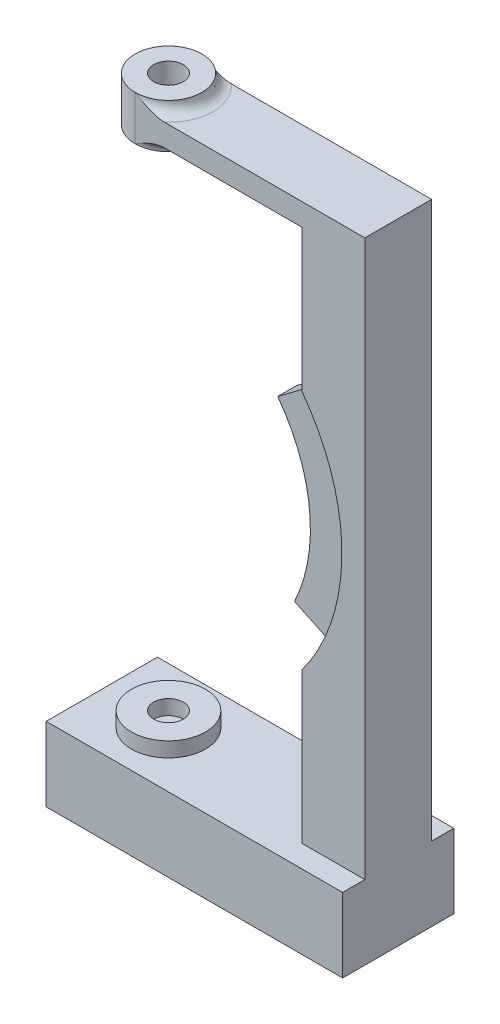
ISO-10303-21;
HEADER;
FILE_DESCRIPTION(('STEP AP214'),'2;1');
FILE_NAME('part.step','',(''),(''),'','','');
FILE_SCHEMA(('AUTOMOTIVE_DESIGN { 1 0 10303 214 1 1 1 1 }'));
ENDSEC;
DATA;
#1=APPLICATION_CONTEXT('core data for automotive mechanical design processes');
#2=APPLICATION_PROTOCOL_DEFINITION('international standard','automotive_design',2000,#1);
#3=PRODUCT_CONTEXT('',#1,'mechanical');
#4=PRODUCT('Part','Part','',(#3));
#5=PRODUCT_RELATED_PRODUCT_CATEGORY('part','',(#4));
#6=PRODUCT_DEFINITION_FORMATION('','',#4);
#7=PRODUCT_DEFINITION_CONTEXT('part definition',#1,'design');
#8=PRODUCT_DEFINITION('design','',#6,#7);
#9=PRODUCT_DEFINITION_SHAPE('','',#8);
#10=(LENGTH_UNIT() NAMED_UNIT(*) SI_UNIT(.MILLI.,.METRE.));
#11=(NAMED_UNIT(*) PLANE_ANGLE_UNIT() SI_UNIT($,.RADIAN.));
#12=(NAMED_UNIT(*) SI_UNIT($,.STERADIAN.) SOLID_ANGLE_UNIT());
#13=UNCERTAINTY_MEASURE_WITH_UNIT(LENGTH_MEASURE(1.E-05),#10,'distance_accuracy_value','');
#14=(GEOMETRIC_REPRESENTATION_CONTEXT(3) GLOBAL_UNCERTAINTY_ASSIGNED_CONTEXT((#13)) GLOBAL_UNIT_ASSIGNED_CONTEXT((#10,
#11,#12)) REPRESENTATION_CONTEXT('',''));
#15=CARTESIAN_POINT('',(0.,0.,0.));
#16=DIRECTION('',(0.,0.,1.));
#17=DIRECTION('',(1.,0.,0.));
#18=AXIS2_PLACEMENT_3D('',#15,#16,#17);
#19=CARTESIAN_POINT('',(-60.7,93.1,-30.));
#20=DIRECTION('',(0.,0.,1.));
#21=DIRECTION('',(1.,0.,0.));
#22=AXIS2_PLACEMENT_3D('',#19,#20,#21);
#23=CYLINDRICAL_SURFACE('',#22,54.5);
#24=CARTESIAN_POINT('',(-60.7,93.1,-22.5));
#25=DIRECTION('',(0.,0.,1.));
#26=DIRECTION('',(1.,0.,0.));
#27=AXIS2_PLACEMENT_3D('',#24,#25,#26);
#28=CIRCLE('',#27,54.5);
#29=CARTESIAN_POINT('',(-11.4562288879706,69.7483189755841,-22.5));
#30=VERTEX_POINT('',#29);
#31=CARTESIAN_POINT('',(-17.,125.666240188269,-22.5));
#32=VERTEX_POINT('',#31);
#33=EDGE_CURVE('E218',#30,#32,#28,.T.);
#34=ORIENTED_EDGE('',*,*,#33,.T.);
#35=DIRECTION('',(0.,0.,1.));
#36=VECTOR('',#35,1.);
#37=CARTESIAN_POINT('',(-17.,125.666240188269,-30.));
#38=LINE('',#37,#36);
#39=CARTESIAN_POINT('',(-17.,125.666240188269,-24.));
#40=VERTEX_POINT('',#39);
#41=EDGE_CURVE('E226',#40,#32,#38,.T.);
#42=ORIENTED_EDGE('',*,*,#41,.F.);
#43=CARTESIAN_POINT('',(-60.7,93.1,-24.));
#44=DIRECTION('',(0.,0.,1.));
#45=DIRECTION('',(1.,0.,0.));
#46=AXIS2_PLACEMENT_3D('',#43,#44,#45);
#47=CIRCLE('',#46,54.5);
#48=CARTESIAN_POINT('',(-17.,60.5337598117314,-24.));
#49=VERTEX_POINT('',#48);
#50=EDGE_CURVE('E244',#49,#40,#47,.T.);
#51=ORIENTED_EDGE('',*,*,#50,.F.);
#52=DIRECTION('',(0.,0.,1.));
#53=VECTOR('',#52,1.);
#54=CARTESIAN_POINT('',(-17.,60.5337598117314,-30.));
#55=LINE('',#54,#53);
#56=CARTESIAN_POINT('',(-17.,60.5337598117314,-6.));
#57=VERTEX_POINT('',#56);
#58=EDGE_CURVE('E238',#49,#57,#55,.T.);
#59=ORIENTED_EDGE('',*,*,#58,.T.);
#60=CARTESIAN_POINT('',(-60.7,93.1,-6.));
#61=DIRECTION('',(0.,0.,1.));
#62=DIRECTION('',(1.,0.,0.));
#63=AXIS2_PLACEMENT_3D('',#60,#61,#62);
#64=CIRCLE('',#63,54.5);
#65=CARTESIAN_POINT('',(-17.,125.666240188269,-6.));
#66=VERTEX_POINT('',#65);
#67=EDGE_CURVE('E248',#57,#66,#64,.T.);
#68=ORIENTED_EDGE('',*,*,#67,.T.);
#69=CARTESIAN_POINT('',(-17.,125.666240188269,-7.5));
#70=VERTEX_POINT('',#69);
#71=EDGE_CURVE('E241',#70,#66,#38,.T.);
#72=ORIENTED_EDGE('',*,*,#71,.F.);
#73=CARTESIAN_POINT('',(-60.7,93.1,-7.5));
#74=DIRECTION('',(0.,0.,1.));
#75=DIRECTION('',(1.,0.,0.));
#76=AXIS2_PLACEMENT_3D('',#73,#74,#75);
#77=CIRCLE('',#76,54.5);
#78=CARTESIAN_POINT('',(-11.4562288879706,69.7483189755841,-7.5));
#79=VERTEX_POINT('',#78);
#80=EDGE_CURVE('E281',#79,#70,#77,.T.);
#81=ORIENTED_EDGE('',*,*,#80,.F.);
#82=DIRECTION('',(0.,0.,1.));
#83=VECTOR('',#82,1.);
#84=CARTESIAN_POINT('',(-11.4562288879706,69.7483189755841,-12.5));
#85=LINE('',#84,#83);
#86=CARTESIAN_POINT('',(-11.4562288879706,69.7483189755841,-12.5));
#87=VERTEX_POINT('',#86);
#88=EDGE_CURVE('E254',#87,#79,#85,.T.);
#89=ORIENTED_EDGE('',*,*,#88,.F.);
#90=CARTESIAN_POINT('',(-60.7,93.1,-12.5));
#91=DIRECTION('',(0.,0.,1.));
#92=DIRECTION('',(1.,0.,0.));
#93=AXIS2_PLACEMENT_3D('',#90,#91,#92);
#94=CIRCLE('',#93,54.5);
#95=CARTESIAN_POINT('',(-17.,125.666240188269,-12.5));
#96=VERTEX_POINT('',#95);
#97=EDGE_CURVE('E273',#87,#96,#94,.T.);
#98=ORIENTED_EDGE('',*,*,#97,.T.);
#99=CARTESIAN_POINT('',(-17.,125.666240188269,-17.5));
#100=VERTEX_POINT('',#99);
#101=EDGE_CURVE('E239',#100,#96,#38,.T.);
#102=ORIENTED_EDGE('',*,*,#101,.F.);
#103=CARTESIAN_POINT('',(-60.7,93.1,-17.5));
#104=DIRECTION('',(0.,0.,1.));
#105=DIRECTION('',(1.,0.,0.));
#106=AXIS2_PLACEMENT_3D('',#103,#104,#105);
#107=CIRCLE('',#106,54.5);
#108=CARTESIAN_POINT('',(-11.4562288879706,69.7483189755841,-17.5));
#109=VERTEX_POINT('',#108);
#110=EDGE_CURVE('E63',#109,#100,#107,.T.);
#111=ORIENTED_EDGE('',*,*,#110,.F.);
#112=DIRECTION('',(0.,0.,1.));
#113=VECTOR('',#112,1.);
#114=CARTESIAN_POINT('',(-11.4562288879706,69.7483189755841,-22.5));
#115=LINE('',#114,#113);
#116=EDGE_CURVE('E228',#30,#109,#115,.T.);
#117=ORIENTED_EDGE('',*,*,#116,.F.);
#118=EDGE_LOOP('',(#34,#42,#51,#59,#68,#72,#81,#89,#98,#102,#111,#117));
#119=FACE_BOUND('',#118,.T.);
#120=ADVANCED_FACE('F41',(#119),#23,.F.);
#121=CARTESIAN_POINT('',(-17.,170.,-24.));
#122=DIRECTION('',(1.,0.,0.));
#123=DIRECTION('',(0.,0.,-1.));
#124=AXIS2_PLACEMENT_3D('',#121,#122,#123);
#125=PLANE('',#124);
#126=DIRECTION('',(0.,-1.,0.));
#127=VECTOR('',#126,1.);
#128=CARTESIAN_POINT('',(-17.,170.,-24.));
#129=LINE('',#128,#127);
#130=CARTESIAN_POINT('',(-17.,164.,-24.));
#131=VERTEX_POINT('',#130);
#132=EDGE_CURVE('E236',#131,#40,#129,.T.);
#133=ORIENTED_EDGE('',*,*,#132,.T.);
#134=ORIENTED_EDGE('',*,*,#41,.T.);
#135=DIRECTION('',(0.,0.,1.));
#136=VECTOR('',#135,1.);
#137=CARTESIAN_POINT('',(-17.,125.666240188269,-22.5));
#138=LINE('',#137,#136);
#139=EDGE_CURVE('E201',#32,#100,#138,.T.);
#140=ORIENTED_EDGE('',*,*,#139,.T.);
#141=ORIENTED_EDGE('',*,*,#101,.T.);
#142=DIRECTION('',(0.,0.,1.));
#143=VECTOR('',#142,1.);
#144=CARTESIAN_POINT('',(-17.,125.666240188269,-12.5));
#145=LINE('',#144,#143);
#146=EDGE_CURVE('E262',#96,#70,#145,.T.);
#147=ORIENTED_EDGE('',*,*,#146,.T.);
#148=ORIENTED_EDGE('',*,*,#71,.T.);
#149=DIRECTION('',(0.,-1.,0.));
#150=VECTOR('',#149,1.);
#151=CARTESIAN_POINT('',(-17.,170.,-6.));
#152=LINE('',#151,#150);
#153=CARTESIAN_POINT('',(-17.,164.,-6.));
#154=VERTEX_POINT('',#153);
#155=EDGE_CURVE('E463',#154,#66,#152,.T.);
#156=ORIENTED_EDGE('',*,*,#155,.F.);
#157=DIRECTION('',(0.,0.,1.));
#158=VECTOR('',#157,1.);
#159=CARTESIAN_POINT('',(-17.,164.,-24.));
#160=LINE('',#159,#158);
#161=EDGE_CURVE('E567',#131,#154,#160,.T.);
#162=ORIENTED_EDGE('',*,*,#161,.F.);
#163=EDGE_LOOP('',(#133,#134,#140,#141,#147,#148,#156,#162));
#164=FACE_BOUND('',#163,.T.);
#165=ADVANCED_FACE('F233',(#164),#125,.F.);
#166=CARTESIAN_POINT('',(0.,170.,0.));
#167=DIRECTION('',(0.,-1.,0.));
#168=DIRECTION('',(0.,0.,-1.));
#169=AXIS2_PLACEMENT_3D('',#166,#167,#168);
#170=PLANE('',#169);
#171=DIRECTION('',(-1.,0.,0.));
#172=VECTOR('',#171,1.);
#173=CARTESIAN_POINT('',(0.,170.,-24.));
#174=LINE('',#173,#172);
#175=CARTESIAN_POINT('',(0.,170.,-24.));
#176=VERTEX_POINT('',#175);
#177=CARTESIAN_POINT('',(-54.0627460668062,170.,-24.));
#178=VERTEX_POINT('',#177);
#179=EDGE_CURVE('E588',#176,#178,#174,.T.);
#180=ORIENTED_EDGE('',*,*,#179,.T.);
#181=CARTESIAN_POINT('',(-62.,170.,-15.));
#182=DIRECTION('',(0.,-1.,0.));
#183=DIRECTION('',(0.,0.,-1.));
#184=AXIS2_PLACEMENT_3D('',#181,#182,#183);
#185=CIRCLE('',#184,12.);
#186=CARTESIAN_POINT('',(-54.0627460668062,170.,-6.));
#187=VERTEX_POINT('',#186);
#188=EDGE_CURVE('E524',#178,#187,#185,.T.);
#189=ORIENTED_EDGE('',*,*,#188,.T.);
#190=DIRECTION('',(1.,0.,0.));
#191=VECTOR('',#190,1.);
#192=CARTESIAN_POINT('',(0.,170.,-6.));
#193=LINE('',#192,#191);
#194=CARTESIAN_POINT('',(0.,170.,-6.));
#195=VERTEX_POINT('',#194);
#196=EDGE_CURVE('E592',#187,#195,#193,.T.);
#197=ORIENTED_EDGE('',*,*,#196,.T.);
#198=DIRECTION('',(0.,0.,-1.));
#199=VECTOR('',#198,1.);
#200=CARTESIAN_POINT('',(0.,170.,-24.));
#201=LINE('',#200,#199);
#202=EDGE_CURVE('E584',#195,#176,#201,.T.);
#203=ORIENTED_EDGE('',*,*,#202,.T.);
#204=EDGE_LOOP('',(#180,#189,#197,#203));
#205=FACE_BOUND('',#204,.T.);
#206=ADVANCED_FACE('F357',(#205),#170,.F.);
#207=CARTESIAN_POINT('',(-17.,20.,-6.));
#208=VERTEX_POINT('',#207);
#209=EDGE_CURVE('E468',#57,#208,#152,.T.);
#210=ORIENTED_EDGE('',*,*,#209,.F.);
#211=ORIENTED_EDGE('',*,*,#58,.F.);
#212=CARTESIAN_POINT('',(-17.,20.,-24.));
#213=VERTEX_POINT('',#212);
#214=EDGE_CURVE('E455',#49,#213,#129,.T.);
#215=ORIENTED_EDGE('',*,*,#214,.T.);
#216=DIRECTION('',(0.,0.,1.));
#217=VECTOR('',#216,1.);
#218=CARTESIAN_POINT('',(-17.,20.,-24.));
#219=LINE('',#218,#217);
#220=EDGE_CURVE('E598',#213,#208,#219,.T.);
#221=ORIENTED_EDGE('',*,*,#220,.T.);
#222=EDGE_LOOP('',(#210,#211,#215,#221));
#223=FACE_BOUND('',#222,.T.);
#224=ADVANCED_FACE('F359',(#223),#125,.F.);
#225=CARTESIAN_POINT('',(0.,20.,0.));
#226=DIRECTION('',(-1.,0.,0.));
#227=DIRECTION('',(0.,0.,1.));
#228=AXIS2_PLACEMENT_3D('',#225,#226,#227);
#229=PLANE('',#228);
#230=DIRECTION('',(0.,-1.,0.));
#231=VECTOR('',#230,1.);
#232=CARTESIAN_POINT('',(0.,170.,-6.));
#233=LINE('',#232,#231);
#234=CARTESIAN_POINT('',(0.,20.,-6.));
#235=VERTEX_POINT('',#234);
#236=EDGE_CURVE('E595',#195,#235,#233,.T.);
#237=ORIENTED_EDGE('',*,*,#236,.T.);
#238=DIRECTION('',(0.,0.,-1.));
#239=VECTOR('',#238,1.);
#240=CARTESIAN_POINT('',(0.,20.,0.));
#241=LINE('',#240,#239);
#242=CARTESIAN_POINT('',(0.,20.,0.));
#243=VERTEX_POINT('',#242);
#244=EDGE_CURVE('E475',#243,#235,#241,.T.);
#245=ORIENTED_EDGE('',*,*,#244,.F.);
#246=DIRECTION('',(0.,-1.,0.));
#247=VECTOR('',#246,1.);
#248=CARTESIAN_POINT('',(0.,20.,0.));
#249=LINE('',#248,#247);
#250=CARTESIAN_POINT('',(0.,0.,0.));
#251=VERTEX_POINT('',#250);
#252=EDGE_CURVE('E489',#243,#251,#249,.T.);
#253=ORIENTED_EDGE('',*,*,#252,.T.);
#254=DIRECTION('',(0.,0.,-1.));
#255=VECTOR('',#254,1.);
#256=CARTESIAN_POINT('',(0.,0.,0.));
#257=LINE('',#256,#255);
#258=CARTESIAN_POINT('',(0.,0.,-30.));
#259=VERTEX_POINT('',#258);
#260=EDGE_CURVE('E474',#251,#259,#257,.T.);
#261=ORIENTED_EDGE('',*,*,#260,.T.);
#262=DIRECTION('',(0.,-1.,0.));
#263=VECTOR('',#262,1.);
#264=CARTESIAN_POINT('',(0.,20.,-30.));
#265=LINE('',#264,#263);
#266=CARTESIAN_POINT('',(0.,20.,-30.));
#267=VERTEX_POINT('',#266);
#268=EDGE_CURVE('E513',#267,#259,#265,.T.);
#269=ORIENTED_EDGE('',*,*,#268,.F.);
#270=CARTESIAN_POINT('',(0.,20.,-24.));
#271=VERTEX_POINT('',#270);
#272=EDGE_CURVE('E480',#271,#267,#241,.T.);
#273=ORIENTED_EDGE('',*,*,#272,.F.);
#274=DIRECTION('',(0.,-1.,0.));
#275=VECTOR('',#274,1.);
#276=CARTESIAN_POINT('',(0.,170.,-24.));
#277=LINE('',#276,#275);
#278=EDGE_CURVE('E467',#176,#271,#277,.T.);
#279=ORIENTED_EDGE('',*,*,#278,.F.);
#280=ORIENTED_EDGE('',*,*,#202,.F.);
#281=EDGE_LOOP('',(#237,#245,#253,#261,#269,#273,#279,#280));
#282=FACE_BOUND('',#281,.T.);
#283=ADVANCED_FACE('F423',(#282),#229,.F.);
#284=CARTESIAN_POINT('',(0.,20.,-30.));
#285=DIRECTION('',(0.,0.,1.));
#286=DIRECTION('',(1.,0.,0.));
#287=AXIS2_PLACEMENT_3D('',#284,#285,#286);
#288=PLANE('',#287);
#289=DIRECTION('',(-1.,0.,0.));
#290=VECTOR('',#289,1.);
#291=CARTESIAN_POINT('',(0.,0.,-30.));
#292=LINE('',#291,#290);
#293=CARTESIAN_POINT('',(-80.,0.,-30.));
#294=VERTEX_POINT('',#293);
#295=EDGE_CURVE('E493',#259,#294,#292,.T.);
#296=ORIENTED_EDGE('',*,*,#295,.T.);
#297=DIRECTION('',(0.,-1.,0.));
#298=VECTOR('',#297,1.);
#299=CARTESIAN_POINT('',(-80.,20.,-30.));
#300=LINE('',#299,#298);
#301=CARTESIAN_POINT('',(-80.,20.,-30.));
#302=VERTEX_POINT('',#301);
#303=EDGE_CURVE('E509',#302,#294,#300,.T.);
#304=ORIENTED_EDGE('',*,*,#303,.F.);
#305=DIRECTION('',(-1.,0.,0.));
#306=VECTOR('',#305,1.);
#307=CARTESIAN_POINT('',(0.,20.,-30.));
#308=LINE('',#307,#306);
#309=EDGE_CURVE('E479',#267,#302,#308,.T.);
#310=ORIENTED_EDGE('',*,*,#309,.F.);
#311=ORIENTED_EDGE('',*,*,#268,.T.);
#312=EDGE_LOOP('',(#296,#304,#310,#311));
#313=FACE_BOUND('',#312,.T.);
#314=ADVANCED_FACE('F427',(#313),#288,.F.);
#315=CARTESIAN_POINT('',(-80.,20.,0.));
#316=DIRECTION('',(1.,0.,0.));
#317=DIRECTION('',(0.,0.,-1.));
#318=AXIS2_PLACEMENT_3D('',#315,#316,#317);
#319=PLANE('',#318);
#320=DIRECTION('',(0.,0.,1.));
#321=VECTOR('',#320,1.);
#322=CARTESIAN_POINT('',(-80.,0.,0.));
#323=LINE('',#322,#321);
#324=CARTESIAN_POINT('',(-80.,0.,0.));
#325=VERTEX_POINT('',#324);
#326=EDGE_CURVE('E496',#294,#325,#323,.T.);
#327=ORIENTED_EDGE('',*,*,#326,.T.);
#328=DIRECTION('',(0.,-1.,0.));
#329=VECTOR('',#328,1.);
#330=CARTESIAN_POINT('',(-80.,20.,0.));
#331=LINE('',#330,#329);
#332=CARTESIAN_POINT('',(-80.,20.,0.));
#333=VERTEX_POINT('',#332);
#334=EDGE_CURVE('E505',#333,#325,#331,.T.);
#335=ORIENTED_EDGE('',*,*,#334,.F.);
#336=DIRECTION('',(0.,0.,1.));
#337=VECTOR('',#336,1.);
#338=CARTESIAN_POINT('',(-80.,20.,0.));
#339=LINE('',#338,#337);
#340=EDGE_CURVE('E483',#302,#333,#339,.T.);
#341=ORIENTED_EDGE('',*,*,#340,.F.);
#342=ORIENTED_EDGE('',*,*,#303,.T.);
#343=EDGE_LOOP('',(#327,#335,#341,#342));
#344=FACE_BOUND('',#343,.T.);
#345=ADVANCED_FACE('F431',(#344),#319,.F.);
#346=CARTESIAN_POINT('',(0.,20.,0.));
#347=DIRECTION('',(0.,0.,-1.));
#348=DIRECTION('',(-1.,0.,0.));
#349=AXIS2_PLACEMENT_3D('',#346,#347,#348);
#350=PLANE('',#349);
#351=DIRECTION('',(1.,0.,0.));
#352=VECTOR('',#351,1.);
#353=CARTESIAN_POINT('',(0.,0.,0.));
#354=LINE('',#353,#352);
#355=EDGE_CURVE('E499',#325,#251,#354,.T.);
#356=ORIENTED_EDGE('',*,*,#355,.T.);
#357=ORIENTED_EDGE('',*,*,#252,.F.);
#358=DIRECTION('',(1.,0.,0.));
#359=VECTOR('',#358,1.);
#360=CARTESIAN_POINT('',(0.,20.,0.));
#361=LINE('',#360,#359);
#362=EDGE_CURVE('E486',#333,#243,#361,.T.);
#363=ORIENTED_EDGE('',*,*,#362,.F.);
#364=ORIENTED_EDGE('',*,*,#334,.T.);
#365=EDGE_LOOP('',(#356,#357,#363,#364));
#366=FACE_BOUND('',#365,.T.);
#367=ADVANCED_FACE('F435',(#366),#350,.F.);
#368=CARTESIAN_POINT('',(0.,20.,0.));
#369=DIRECTION('',(0.,1.,0.));
#370=DIRECTION('',(0.,0.,1.));
#371=AXIS2_PLACEMENT_3D('',#368,#369,#370);
#372=PLANE('',#371);
#373=CARTESIAN_POINT('',(-62.,20.,-15.));
#374=DIRECTION('',(0.,1.,0.));
#375=DIRECTION('',(0.,0.,1.));
#376=AXIS2_PLACEMENT_3D('',#373,#374,#375);
#377=CIRCLE('',#376,10.);
#378=CARTESIAN_POINT('',(-62.,20.,-4.99999999999999));
#379=VERTEX_POINT('',#378);
#380=EDGE_CURVE('E576',#379,#379,#377,.T.);
#381=ORIENTED_EDGE('',*,*,#380,.F.);
#382=EDGE_LOOP('',(#381));
#383=FACE_BOUND('',#382,.T.);
#384=DIRECTION('',(1.,0.,0.));
#385=VECTOR('',#384,1.);
#386=CARTESIAN_POINT('',(0.,20.,-6.));
#387=LINE('',#386,#385);
#388=EDGE_CURVE('E589',#208,#235,#387,.T.);
#389=ORIENTED_EDGE('',*,*,#388,.F.);
#390=ORIENTED_EDGE('',*,*,#220,.F.);
#391=DIRECTION('',(-1.,0.,0.));
#392=VECTOR('',#391,1.);
#393=CARTESIAN_POINT('',(0.,20.,-24.));
#394=LINE('',#393,#392);
#395=EDGE_CURVE('E457',#271,#213,#394,.T.);
#396=ORIENTED_EDGE('',*,*,#395,.F.);
#397=ORIENTED_EDGE('',*,*,#272,.T.);
#398=ORIENTED_EDGE('',*,*,#309,.T.);
#399=ORIENTED_EDGE('',*,*,#340,.T.);
#400=ORIENTED_EDGE('',*,*,#362,.T.);
#401=ORIENTED_EDGE('',*,*,#244,.T.);
#402=EDGE_LOOP('',(#389,#390,#396,#397,#398,#399,#400,#401));
#403=FACE_BOUND('',#402,.T.);
#404=ADVANCED_FACE('F439',(#383,#403),#372,.T.);
#405=CARTESIAN_POINT('',(0.,0.,0.));
#406=DIRECTION('',(0.,1.,0.));
#407=DIRECTION('',(0.,0.,1.));
#408=AXIS2_PLACEMENT_3D('',#405,#406,#407);
#409=PLANE('',#408);
#410=ORIENTED_EDGE('',*,*,#260,.F.);
#411=ORIENTED_EDGE('',*,*,#355,.F.);
#412=ORIENTED_EDGE('',*,*,#326,.F.);
#413=ORIENTED_EDGE('',*,*,#295,.F.);
#414=EDGE_LOOP('',(#410,#411,#412,#413));
#415=FACE_BOUND('',#414,.T.);
#416=ADVANCED_FACE('F441',(#415),#409,.F.);
#417=CARTESIAN_POINT('',(0.,170.,-24.));
#418=DIRECTION('',(0.,0.,1.));
#419=DIRECTION('',(1.,0.,0.));
#420=AXIS2_PLACEMENT_3D('',#417,#418,#419);
#421=PLANE('',#420);
#422=ORIENTED_EDGE('',*,*,#214,.F.);
#423=ORIENTED_EDGE('',*,*,#50,.T.);
#424=ORIENTED_EDGE('',*,*,#132,.F.);
#425=DIRECTION('',(-1.,0.,0.));
#426=VECTOR('',#425,1.);
#427=CARTESIAN_POINT('',(0.,164.,-24.));
#428=LINE('',#427,#426);
#429=CARTESIAN_POINT('',(-54.0627460668062,164.,-24.));
#430=VERTEX_POINT('',#429);
#431=EDGE_CURVE('E535',#131,#430,#428,.T.);
#432=ORIENTED_EDGE('',*,*,#431,.T.);
#433=CARTESIAN_POINT('',(-54.0627460668062,164.,-24.));
#434=CARTESIAN_POINT('',(-54.1760862791798,163.999996097603,-24.));
#435=CARTESIAN_POINT('',(-54.2893969372354,163.997190433976,-24.));
#436=CARTESIAN_POINT('',(-54.515730825254,163.986357448924,-24.));
#437=CARTESIAN_POINT('',(-54.628754143122,163.978331985279,-24.));
#438=CARTESIAN_POINT('',(-54.9666697149848,163.947041583533,-24.));
#439=CARTESIAN_POINT('',(-55.1909135662553,163.916559181755,-24.));
#440=CARTESIAN_POINT('',(-55.6332406605233,163.83963787401,-24.));
#441=CARTESIAN_POINT('',(-55.851366137291,163.793433853769,-24.));
#442=CARTESIAN_POINT('',(-56.2843447100589,163.687279691333,-24.));
#443=CARTESIAN_POINT('',(-56.4991958271631,163.627321562659,-24.));
#444=CARTESIAN_POINT('',(-56.9449632459061,163.489661664973,-24.));
#445=CARTESIAN_POINT('',(-57.1755282529704,163.410831905841,-24.));
#446=CARTESIAN_POINT('',(-57.6324065176434,163.241615603191,-24.));
#447=CARTESIAN_POINT('',(-57.8587185353015,163.151225747512,-24.));
#448=CARTESIAN_POINT('',(-58.531954936859,162.865796343792,-24.));
#449=CARTESIAN_POINT('',(-58.9728564658495,162.656603043088,-24.));
#450=CARTESIAN_POINT('',(-59.8453025186559,162.21358041951,-24.));
#451=CARTESIAN_POINT('',(-60.2767677897122,161.979600085545,-24.));
#452=CARTESIAN_POINT('',(-61.133362874173,161.500263148594,-23.9999999999999));
#453=CARTESIAN_POINT('',(-61.5584912659528,161.254904042163,-23.9999999999998));
#454=CARTESIAN_POINT('',(-61.9890455505519,161.006324553064,-24.));
#455=CARTESIAN_POINT('',(-61.9945227761524,161.00316227536,-24.));
#456=CARTESIAN_POINT('',(-62.,161.,-24.));
#457=B_SPLINE_CURVE_WITH_KNOTS('',3,(#433,#434,#435,#436,#437,#438,#439,#440,#441,#442,#443,
#444,#445,#446,#447,#448,#449,#450,#451,#452,#453,#454,#455,#456),.UNSPECIFIED.,.F.,.F.,(4,2,2,
2,2,2,2,2,2,2,2,4),(0.,0.339937513647226,0.679754106273997,1.35787472815943,2.0262791107125,
2.69507259674562,3.42570134991749,4.15653991138376,5.61923374816456,7.09141610075236,
8.56392389935176,8.58289756531276),.UNSPECIFIED.);
#458=CARTESIAN_POINT('',(-62.,161.,-24.));
#459=VERTEX_POINT('',#458);
#460=EDGE_CURVE('E409',#430,#459,#457,.T.);
#461=ORIENTED_EDGE('',*,*,#460,.T.);
#462=DIRECTION('',(0.,1.,0.));
#463=VECTOR('',#462,1.);
#464=CARTESIAN_POINT('',(-62.,164.,-24.));
#465=LINE('',#464,#463);
#466=CARTESIAN_POINT('',(-62.,173.,-24.));
#467=VERTEX_POINT('',#466);
#468=EDGE_CURVE('E533',#459,#467,#465,.T.);
#469=ORIENTED_EDGE('',*,*,#468,.T.);
#470=CARTESIAN_POINT('',(-54.0627460668062,170.,-24.));
#471=CARTESIAN_POINT('',(-54.1760862791798,170.000003902397,-24.));
#472=CARTESIAN_POINT('',(-54.2893969372354,170.002809566024,-24.));
#473=CARTESIAN_POINT('',(-54.515730825254,170.013642551076,-24.));
#474=CARTESIAN_POINT('',(-54.628754143122,170.021668014721,-24.));
#475=CARTESIAN_POINT('',(-54.9666697149848,170.052958416467,-24.));
#476=CARTESIAN_POINT('',(-55.1909135662553,170.083440818245,-24.));
#477=CARTESIAN_POINT('',(-55.6332406605233,170.16036212599,-24.));
#478=CARTESIAN_POINT('',(-55.851366137291,170.206566146231,-24.));
#479=CARTESIAN_POINT('',(-56.2843447100589,170.312720308667,-24.));
#480=CARTESIAN_POINT('',(-56.4991958271631,170.372678437341,-24.));
#481=CARTESIAN_POINT('',(-56.9449632459061,170.510338335027,-24.));
#482=CARTESIAN_POINT('',(-57.1755282529704,170.589168094159,-24.));
#483=CARTESIAN_POINT('',(-57.6324065176434,170.758384396809,-24.));
#484=CARTESIAN_POINT('',(-57.8587185353015,170.848774252488,-24.));
#485=CARTESIAN_POINT('',(-58.531954936859,171.134203656208,-24.));
#486=CARTESIAN_POINT('',(-58.9728564658495,171.343396956912,-24.));
#487=CARTESIAN_POINT('',(-59.8453025186559,171.78641958049,-24.));
#488=CARTESIAN_POINT('',(-60.2767677897122,172.020399914455,-24.));
#489=CARTESIAN_POINT('',(-61.133362874173,172.499736851406,-23.9999999999999));
#490=CARTESIAN_POINT('',(-61.5584912659528,172.745095957837,-23.9999999999998));
#491=CARTESIAN_POINT('',(-61.9890455505519,172.993675446936,-24.));
#492=CARTESIAN_POINT('',(-61.9945227761524,172.99683772464,-24.));
#493=CARTESIAN_POINT('',(-62.,173.,-24.));
#494=B_SPLINE_CURVE_WITH_KNOTS('',3,(#470,#471,#472,#473,#474,#475,#476,#477,#478,#479,#480,
#481,#482,#483,#484,#485,#486,#487,#488,#489,#490,#491,#492,#493),.UNSPECIFIED.,.F.,.F.,(4,2,2,
2,2,2,2,2,2,2,2,4),(0.,0.339937513647233,0.679754106274004,1.35787472815945,2.02627911071252,
2.69507259674564,3.42570134991753,4.15653991138376,5.61923374816454,7.09141610075234,
8.56392389935177,8.58289756531276),.UNSPECIFIED.);
#495=EDGE_CURVE('E56',#467,#178,#494,.F.);
#496=ORIENTED_EDGE('',*,*,#495,.T.);
#497=ORIENTED_EDGE('',*,*,#179,.F.);
#498=ORIENTED_EDGE('',*,*,#278,.T.);
#499=ORIENTED_EDGE('',*,*,#395,.T.);
#500=EDGE_LOOP('',(#422,#423,#424,#432,#461,#469,#496,#497,#498,#499));
#501=FACE_BOUND('',#500,.T.);
#502=ADVANCED_FACE('F397',(#501),#421,.F.);
#503=CARTESIAN_POINT('',(0.,170.,-6.));
#504=DIRECTION('',(0.,0.,-1.));
#505=DIRECTION('',(-1.,0.,0.));
#506=AXIS2_PLACEMENT_3D('',#503,#504,#505);
#507=PLANE('',#506);
#508=ORIENTED_EDGE('',*,*,#155,.T.);
#509=ORIENTED_EDGE('',*,*,#67,.F.);
#510=ORIENTED_EDGE('',*,*,#209,.T.);
#511=ORIENTED_EDGE('',*,*,#388,.T.);
#512=ORIENTED_EDGE('',*,*,#236,.F.);
#513=ORIENTED_EDGE('',*,*,#196,.F.);
#514=CARTESIAN_POINT('',(-54.0627460668062,170.,-6.));
#515=CARTESIAN_POINT('',(-54.1760862791799,170.000003902397,-6.));
#516=CARTESIAN_POINT('',(-54.2893969372358,170.002809566024,-6.));
#517=CARTESIAN_POINT('',(-54.5157308252547,170.013642551076,-6.));
#518=CARTESIAN_POINT('',(-54.628754143123,170.021668014721,-6.));
#519=CARTESIAN_POINT('',(-54.9666697149862,170.052958416468,-6.));
#520=CARTESIAN_POINT('',(-55.190913566257,170.083440818245,-6.));
#521=CARTESIAN_POINT('',(-55.6332406605249,170.16036212599,-6.));
#522=CARTESIAN_POINT('',(-55.8513661372922,170.206566146232,-6.));
#523=CARTESIAN_POINT('',(-56.2843447100595,170.312720308667,-6.));
#524=CARTESIAN_POINT('',(-56.4991958271634,170.372678437341,-6.));
#525=CARTESIAN_POINT('',(-56.944963245906,170.510338335027,-6.));
#526=CARTESIAN_POINT('',(-57.1755282529703,170.589168094159,-6.));
#527=CARTESIAN_POINT('',(-57.6324065176432,170.758384396809,-6.));
#528=CARTESIAN_POINT('',(-57.8587185353012,170.848774252488,-6.));
#529=CARTESIAN_POINT('',(-58.5319549368583,171.134203656208,-6.));
#530=CARTESIAN_POINT('',(-58.9728564658482,171.343396956912,-6.00000000000001));
#531=CARTESIAN_POINT('',(-59.8453025186553,171.786419580489,-5.99999999999998));
#532=CARTESIAN_POINT('',(-60.2767677897128,172.020399914452,-5.99999999999995));
#533=CARTESIAN_POINT('',(-61.133362874171,172.499736851408,-6.00000000000005));
#534=CARTESIAN_POINT('',(-61.5584912659468,172.745095957846,-6.0000000000002));
#535=CARTESIAN_POINT('',(-61.9890455505517,172.993675446936,-6.));
#536=CARTESIAN_POINT('',(-61.9945227761523,172.99683772464,-5.99999999999999));
#537=CARTESIAN_POINT('',(-62.,173.,-5.99999999999999));
#538=B_SPLINE_CURVE_WITH_KNOTS('',3,(#514,#515,#516,#517,#518,#519,#520,#521,#522,#523,#524,
#525,#526,#527,#528,#529,#530,#531,#532,#533,#534,#535,#536,#537),.UNSPECIFIED.,.F.,.F.,(4,2,2,
2,2,2,2,2,2,2,2,4),(0.,0.339937513647803,0.679754106275154,1.3578747281615,2.02627911071347,
2.69507259674563,3.42570134991729,4.15653991138341,5.61923374816323,7.09141610075153,
8.56392389935173,8.58289756531276),.UNSPECIFIED.);
#539=CARTESIAN_POINT('',(-62.,173.,-5.99999999999999));
#540=VERTEX_POINT('',#539);
#541=EDGE_CURVE('E11',#187,#540,#538,.T.);
#542=ORIENTED_EDGE('',*,*,#541,.T.);
#543=DIRECTION('',(0.,1.,0.));
#544=VECTOR('',#543,1.);
#545=CARTESIAN_POINT('',(-62.,164.,-5.99999999999999));
#546=LINE('',#545,#544);
#547=CARTESIAN_POINT('',(-62.,161.,-5.99999999999999));
#548=VERTEX_POINT('',#547);
#549=EDGE_CURVE('E564',#548,#540,#546,.T.);
#550=ORIENTED_EDGE('',*,*,#549,.F.);
#551=CARTESIAN_POINT('',(-54.0627460668062,164.,-5.99999999999999));
#552=CARTESIAN_POINT('',(-54.17608627918,163.999996097603,-6.));
#553=CARTESIAN_POINT('',(-54.2893969372358,163.997190433976,-6.));
#554=CARTESIAN_POINT('',(-54.5157308252548,163.986357448924,-6.));
#555=CARTESIAN_POINT('',(-54.628754143123,163.978331985279,-6.));
#556=CARTESIAN_POINT('',(-54.9666697149863,163.947041583532,-6.));
#557=CARTESIAN_POINT('',(-55.1909135662571,163.916559181755,-6.));
#558=CARTESIAN_POINT('',(-55.633240660525,163.83963787401,-6.));
#559=CARTESIAN_POINT('',(-55.8513661372923,163.793433853768,-6.));
#560=CARTESIAN_POINT('',(-56.2843447100595,163.687279691333,-6.));
#561=CARTESIAN_POINT('',(-56.4991958271634,163.627321562659,-6.));
#562=CARTESIAN_POINT('',(-56.944963245906,163.489661664973,-6.));
#563=CARTESIAN_POINT('',(-57.1755282529703,163.410831905841,-6.));
#564=CARTESIAN_POINT('',(-57.6324065176432,163.241615603191,-6.));
#565=CARTESIAN_POINT('',(-57.8587185353012,163.151225747512,-6.));
#566=CARTESIAN_POINT('',(-58.5319549368583,162.865796343792,-6.));
#567=CARTESIAN_POINT('',(-58.9728564658482,162.656603043088,-6.00000000000001));
#568=CARTESIAN_POINT('',(-59.8453025186553,162.213580419511,-5.99999999999998));
#569=CARTESIAN_POINT('',(-60.2767677897129,161.979600085548,-5.99999999999995));
#570=CARTESIAN_POINT('',(-61.133362874171,161.500263148592,-6.00000000000005));
#571=CARTESIAN_POINT('',(-61.5584912659467,161.254904042153,-6.0000000000002));
#572=CARTESIAN_POINT('',(-61.9890455505517,161.006324553064,-6.));
#573=CARTESIAN_POINT('',(-61.9945227761523,161.00316227536,-5.99999999999999));
#574=CARTESIAN_POINT('',(-62.,161.,-5.99999999999999));
#575=B_SPLINE_CURVE_WITH_KNOTS('',3,(#551,#552,#553,#554,#555,#556,#557,#558,#559,#560,#561,
#562,#563,#564,#565,#566,#567,#568,#569,#570,#571,#572,#573,#574),.UNSPECIFIED.,.F.,.F.,(4,2,2,
2,2,2,2,2,2,2,2,4),(0.,0.33993751364781,0.679754106275175,1.35787472816153,2.02627911071347,
2.69507259674563,3.4257013499173,4.15653991138343,5.61923374816323,7.09141610075152,
8.56392389935171,8.58289756531275),.UNSPECIFIED.);
#576=CARTESIAN_POINT('',(-54.0627460668062,164.,-5.99999999999999));
#577=VERTEX_POINT('',#576);
#578=EDGE_CURVE('E402',#548,#577,#575,.F.);
#579=ORIENTED_EDGE('',*,*,#578,.T.);
#580=DIRECTION('',(-1.,0.,0.));
#581=VECTOR('',#580,1.);
#582=CARTESIAN_POINT('',(0.,164.,-6.));
#583=LINE('',#582,#581);
#584=EDGE_CURVE('E560',#154,#577,#583,.T.);
#585=ORIENTED_EDGE('',*,*,#584,.F.);
#586=EDGE_LOOP('',(#508,#509,#510,#511,#512,#513,#542,#550,#579,#585));
#587=FACE_BOUND('',#586,.T.);
#588=ADVANCED_FACE('F388',(#587),#507,.F.);
#589=CARTESIAN_POINT('',(-62.,24.,-15.));
#590=DIRECTION('',(0.,1.,0.));
#591=DIRECTION('',(0.,0.,1.));
#592=AXIS2_PLACEMENT_3D('',#589,#590,#591);
#593=PLANE('',#592);
#594=CARTESIAN_POINT('',(-62.,24.,-15.));
#595=DIRECTION('',(0.,1.,0.));
#596=DIRECTION('',(0.,0.,1.));
#597=AXIS2_PLACEMENT_3D('',#594,#595,#596);
#598=CIRCLE('',#597,10.);
#599=CARTESIAN_POINT('',(-62.,24.,-4.99999999999999));
#600=VERTEX_POINT('',#599);
#601=EDGE_CURVE('E577',#600,#600,#598,.T.);
#602=ORIENTED_EDGE('',*,*,#601,.T.);
#603=EDGE_LOOP('',(#602));
#604=FACE_BOUND('',#603,.T.);
#605=CARTESIAN_POINT('',(-62.,24.,-15.));
#606=DIRECTION('',(0.,1.,0.));
#607=DIRECTION('',(0.,0.,1.));
#608=AXIS2_PLACEMENT_3D('',#605,#606,#607);
#609=CIRCLE('',#608,4.00000000000001);
#610=CARTESIAN_POINT('',(-62.,24.,-11.));
#611=VERTEX_POINT('',#610);
#612=EDGE_CURVE('E572',#611,#611,#609,.T.);
#613=ORIENTED_EDGE('',*,*,#612,.F.);
#614=EDGE_LOOP('',(#613));
#615=FACE_BOUND('',#614,.T.);
#616=ADVANCED_FACE('F385',(#604,#615),#593,.T.);
#617=CARTESIAN_POINT('',(-62.,24.,-15.));
#618=DIRECTION('',(0.,-1.,0.));
#619=DIRECTION('',(0.,0.,-1.));
#620=AXIS2_PLACEMENT_3D('',#617,#618,#619);
#621=CYLINDRICAL_SURFACE('',#620,10.);
#622=ORIENTED_EDGE('',*,*,#601,.F.);
#623=EDGE_LOOP('',(#622));
#624=FACE_BOUND('',#623,.T.);
#625=ORIENTED_EDGE('',*,*,#380,.T.);
#626=EDGE_LOOP('',(#625));
#627=FACE_BOUND('',#626,.T.);
#628=ADVANCED_FACE('F383',(#624,#627),#621,.T.);
#629=CARTESIAN_POINT('',(-62.,24.,-15.));
#630=DIRECTION('',(0.,-1.,0.));
#631=DIRECTION('',(0.,0.,-1.));
#632=AXIS2_PLACEMENT_3D('',#629,#630,#631);
#633=CYLINDRICAL_SURFACE('',#632,4.00000000000001);
#634=ORIENTED_EDGE('',*,*,#612,.T.);
#635=EDGE_LOOP('',(#634));
#636=FACE_BOUND('',#635,.T.);
#637=CARTESIAN_POINT('',(-62.,20.,-15.));
#638=DIRECTION('',(0.,1.,0.));
#639=DIRECTION('',(0.,0.,1.));
#640=AXIS2_PLACEMENT_3D('',#637,#638,#639);
#641=CIRCLE('',#640,4.00000000000001);
#642=CARTESIAN_POINT('',(-62.,20.,-11.));
#643=VERTEX_POINT('',#642);
#644=EDGE_CURVE('E517',#643,#643,#641,.F.);
#645=ORIENTED_EDGE('',*,*,#644,.T.);
#646=EDGE_LOOP('',(#645));
#647=FACE_BOUND('',#646,.T.);
#648=ADVANCED_FACE('F380',(#636,#647),#633,.F.);
#649=ORIENTED_EDGE('',*,*,#644,.F.);
#650=EDGE_LOOP('',(#649));
#651=FACE_BOUND('',#650,.T.);
#652=ADVANCED_FACE('F375',(#651),#372,.T.);
#653=CARTESIAN_POINT('',(0.,164.,0.));
#654=DIRECTION('',(0.,1.,0.));
#655=DIRECTION('',(0.,0.,1.));
#656=AXIS2_PLACEMENT_3D('',#653,#654,#655);
#657=PLANE('',#656);
#658=ORIENTED_EDGE('',*,*,#584,.T.);
#659=CARTESIAN_POINT('',(-62.,164.,-15.));
#660=DIRECTION('',(0.,1.,0.));
#661=DIRECTION('',(0.,0.,1.));
#662=AXIS2_PLACEMENT_3D('',#659,#660,#661);
#663=CIRCLE('',#662,12.);
#664=EDGE_CURVE('E521',#577,#430,#663,.T.);
#665=ORIENTED_EDGE('',*,*,#664,.T.);
#666=ORIENTED_EDGE('',*,*,#431,.F.);
#667=ORIENTED_EDGE('',*,*,#161,.T.);
#668=EDGE_LOOP('',(#658,#665,#666,#667));
#669=FACE_BOUND('',#668,.T.);
#670=ADVANCED_FACE('F372',(#669),#657,.F.);
#671=CARTESIAN_POINT('',(-62.,164.,-15.));
#672=DIRECTION('',(0.,1.,0.));
#673=DIRECTION('',(0.,0.,1.));
#674=AXIS2_PLACEMENT_3D('',#671,#672,#673);
#675=CYLINDRICAL_SURFACE('',#674,9.);
#676=ORIENTED_EDGE('',*,*,#468,.F.);
#677=CARTESIAN_POINT('',(-62.,161.,-15.));
#678=DIRECTION('',(0.,1.,0.));
#679=DIRECTION('',(0.,0.,1.));
#680=AXIS2_PLACEMENT_3D('',#677,#678,#679);
#681=CIRCLE('',#680,9.);
#682=EDGE_CURVE('E541',#459,#548,#681,.T.);
#683=ORIENTED_EDGE('',*,*,#682,.T.);
#684=ORIENTED_EDGE('',*,*,#549,.T.);
#685=CARTESIAN_POINT('',(-62.,173.,-15.));
#686=DIRECTION('',(0.,1.,0.));
#687=DIRECTION('',(0.,0.,1.));
#688=AXIS2_PLACEMENT_3D('',#685,#686,#687);
#689=CIRCLE('',#688,9.);
#690=EDGE_CURVE('E548',#467,#540,#689,.T.);
#691=ORIENTED_EDGE('',*,*,#690,.F.);
#692=EDGE_LOOP('',(#676,#683,#684,#691));
#693=FACE_BOUND('',#692,.T.);
#694=ADVANCED_FACE('F370',(#693),#675,.T.);
#695=CARTESIAN_POINT('',(0.,173.,0.));
#696=DIRECTION('',(0.,1.,0.));
#697=DIRECTION('',(0.,0.,1.));
#698=AXIS2_PLACEMENT_3D('',#695,#696,#697);
#699=PLANE('',#698);
#700=CARTESIAN_POINT('',(-62.,173.,-15.));
#701=DIRECTION('',(0.,1.,0.));
#702=DIRECTION('',(0.,0.,1.));
#703=AXIS2_PLACEMENT_3D('',#700,#701,#702);
#704=CIRCLE('',#703,4.00000000000001);
#705=CARTESIAN_POINT('',(-62.,173.,-11.));
#706=VERTEX_POINT('',#705);
#707=EDGE_CURVE('E880',#706,#706,#704,.T.);
#708=ORIENTED_EDGE('',*,*,#707,.F.);
#709=EDGE_LOOP('',(#708));
#710=FACE_BOUND('',#709,.T.);
#711=EDGE_CURVE('E551',#540,#467,#689,.T.);
#712=ORIENTED_EDGE('',*,*,#711,.T.);
#713=ORIENTED_EDGE('',*,*,#690,.T.);
#714=EDGE_LOOP('',(#712,#713));
#715=FACE_BOUND('',#714,.T.);
#716=ADVANCED_FACE('F366',(#710,#715),#699,.T.);
#717=CARTESIAN_POINT('',(0.,161.,0.));
#718=DIRECTION('',(0.,1.,0.));
#719=DIRECTION('',(0.,0.,1.));
#720=AXIS2_PLACEMENT_3D('',#717,#718,#719);
#721=PLANE('',#720);
#722=CARTESIAN_POINT('',(-62.,161.,-15.));
#723=DIRECTION('',(0.,1.,0.));
#724=DIRECTION('',(0.,0.,1.));
#725=AXIS2_PLACEMENT_3D('',#722,#723,#724);
#726=CIRCLE('',#725,4.00000000000001);
#727=CARTESIAN_POINT('',(-62.,161.,-11.));
#728=VERTEX_POINT('',#727);
#729=EDGE_CURVE('E545',#728,#728,#726,.F.);
#730=ORIENTED_EDGE('',*,*,#729,.F.);
#731=EDGE_LOOP('',(#730));
#732=FACE_BOUND('',#731,.T.);
#733=EDGE_CURVE('E542',#548,#459,#681,.T.);
#734=ORIENTED_EDGE('',*,*,#733,.F.);
#735=ORIENTED_EDGE('',*,*,#682,.F.);
#736=EDGE_LOOP('',(#734,#735));
#737=FACE_BOUND('',#736,.T.);
#738=ADVANCED_FACE('F362',(#732,#737),#721,.F.);
#739=CARTESIAN_POINT('',(-62.,161.,-15.));
#740=DIRECTION('',(0.,1.,0.));
#741=DIRECTION('',(0.,0.,1.));
#742=AXIS2_PLACEMENT_3D('',#739,#740,#741);
#743=TOROIDAL_SURFACE('',#742,12.,3.);
#744=ORIENTED_EDGE('',*,*,#578,.F.);
#745=ORIENTED_EDGE('',*,*,#733,.T.);
#746=ORIENTED_EDGE('',*,*,#460,.F.);
#747=ORIENTED_EDGE('',*,*,#664,.F.);
#748=EDGE_LOOP('',(#744,#745,#746,#747));
#749=FACE_BOUND('',#748,.T.);
#750=ADVANCED_FACE('F365',(#749),#743,.F.);
#751=CARTESIAN_POINT('',(-62.,173.,-15.));
#752=DIRECTION('',(0.,-1.,0.));
#753=DIRECTION('',(0.,0.,-1.));
#754=AXIS2_PLACEMENT_3D('',#751,#752,#753);
#755=TOROIDAL_SURFACE('',#754,12.,3.);
#756=ORIENTED_EDGE('',*,*,#541,.F.);
#757=ORIENTED_EDGE('',*,*,#188,.F.);
#758=ORIENTED_EDGE('',*,*,#495,.F.);
#759=ORIENTED_EDGE('',*,*,#711,.F.);
#760=EDGE_LOOP('',(#756,#757,#758,#759));
#761=FACE_BOUND('',#760,.T.);
#762=ADVANCED_FACE('F43',(#761),#755,.F.);
#763=CARTESIAN_POINT('',(-62.,-0.001000000000001,-15.));
#764=DIRECTION('',(0.,1.,0.));
#765=DIRECTION('',(0.,0.,1.));
#766=AXIS2_PLACEMENT_3D('',#763,#764,#765);
#767=CYLINDRICAL_SURFACE('',#766,4.00000000000001);
#768=ORIENTED_EDGE('',*,*,#707,.T.);
#769=EDGE_LOOP('',(#768));
#770=FACE_BOUND('',#769,.T.);
#771=ORIENTED_EDGE('',*,*,#729,.T.);
#772=EDGE_LOOP('',(#771));
#773=FACE_BOUND('',#772,.T.);
#774=ADVANCED_FACE('F342',(#770,#773),#767,.F.);
#775=CARTESIAN_POINT('',(-20.4917832204531,74.0330310901558,-12.5));
#776=DIRECTION('',(-0.42847121145717,-0.903555433248246,0.));
#777=DIRECTION('',(0.903555433248246,-0.42847121145717,0.));
#778=AXIS2_PLACEMENT_3D('',#775,#776,#777);
#779=PLANE('',#778);
#780=DIRECTION('',(0.903555433248246,-0.42847121145717,0.));
#781=VECTOR('',#780,1.);
#782=CARTESIAN_POINT('',(-20.4917832204531,74.0330310901558,-7.5));
#783=LINE('',#782,#781);
#784=CARTESIAN_POINT('',(-20.4917832204531,74.0330310901558,-7.5));
#785=VERTEX_POINT('',#784);
#786=EDGE_CURVE('E71',#785,#79,#783,.T.);
#787=ORIENTED_EDGE('',*,*,#786,.F.);
#788=DIRECTION('',(0.,0.,1.));
#789=VECTOR('',#788,1.);
#790=CARTESIAN_POINT('',(-20.4917832204531,74.0330310901558,-12.5));
#791=LINE('',#790,#789);
#792=CARTESIAN_POINT('',(-20.4917832204531,74.0330310901558,-12.5));
#793=VERTEX_POINT('',#792);
#794=EDGE_CURVE('E259',#793,#785,#791,.T.);
#795=ORIENTED_EDGE('',*,*,#794,.F.);
#796=DIRECTION('',(0.903555433248246,-0.42847121145717,0.));
#797=VECTOR('',#796,1.);
#798=CARTESIAN_POINT('',(-20.4917832204531,74.0330310901558,-12.5));
#799=LINE('',#798,#797);
#800=EDGE_CURVE('E266',#793,#87,#799,.T.);
#801=ORIENTED_EDGE('',*,*,#800,.T.);
#802=ORIENTED_EDGE('',*,*,#88,.T.);
#803=EDGE_LOOP('',(#787,#795,#801,#802));
#804=FACE_BOUND('',#803,.T.);
#805=ADVANCED_FACE('F340',(#804),#779,.T.);
#806=CARTESIAN_POINT('',(-60.7,93.1,-12.5));
#807=DIRECTION('',(0.,0.,1.));
#808=DIRECTION('',(1.,0.,0.));
#809=AXIS2_PLACEMENT_3D('',#806,#807,#808);
#810=CYLINDRICAL_SURFACE('',#809,44.5);
#811=CARTESIAN_POINT('',(-60.7,93.1,-7.5));
#812=DIRECTION('',(0.,0.,-1.));
#813=DIRECTION('',(1.,0.,0.));
#814=AXIS2_PLACEMENT_3D('',#811,#812,#813);
#815=CIRCLE('',#814,44.5);
#816=CARTESIAN_POINT('',(-25.0183486238532,119.69078327299,-7.5));
#817=VERTEX_POINT('',#816);
#818=EDGE_CURVE('E274',#817,#785,#815,.T.);
#819=ORIENTED_EDGE('',*,*,#818,.F.);
#820=DIRECTION('',(0.,0.,1.));
#821=VECTOR('',#820,1.);
#822=CARTESIAN_POINT('',(-25.0183486238532,119.69078327299,-12.5));
#823=LINE('',#822,#821);
#824=CARTESIAN_POINT('',(-25.0183486238532,119.69078327299,-12.5));
#825=VERTEX_POINT('',#824);
#826=EDGE_CURVE('E265',#825,#817,#823,.T.);
#827=ORIENTED_EDGE('',*,*,#826,.F.);
#828=CARTESIAN_POINT('',(-60.7,93.1,-12.5));
#829=DIRECTION('',(0.,0.,-1.));
#830=DIRECTION('',(1.,0.,0.));
#831=AXIS2_PLACEMENT_3D('',#828,#829,#830);
#832=CIRCLE('',#831,44.5);
#833=EDGE_CURVE('E287',#825,#793,#832,.T.);
#834=ORIENTED_EDGE('',*,*,#833,.T.);
#835=ORIENTED_EDGE('',*,*,#794,.T.);
#836=EDGE_LOOP('',(#819,#827,#834,#835));
#837=FACE_BOUND('',#836,.T.);
#838=ADVANCED_FACE('F336',(#837),#810,.F.);
#839=CARTESIAN_POINT('',(-25.0183486238532,119.69078327299,-12.5));
#840=DIRECTION('',(-0.597545691527864,0.801834862385321,0.));
#841=DIRECTION('',(-0.801834862385321,-0.597545691527864,0.));
#842=AXIS2_PLACEMENT_3D('',#839,#840,#841);
#843=PLANE('',#842);
#844=DIRECTION('',(-0.801834862385321,-0.597545691527864,0.));
#845=VECTOR('',#844,1.);
#846=CARTESIAN_POINT('',(-25.0183486238532,119.69078327299,-7.5));
#847=LINE('',#846,#845);
#848=EDGE_CURVE('E277',#70,#817,#847,.T.);
#849=ORIENTED_EDGE('',*,*,#848,.F.);
#850=ORIENTED_EDGE('',*,*,#146,.F.);
#851=DIRECTION('',(-0.801834862385321,-0.597545691527864,0.));
#852=VECTOR('',#851,1.);
#853=CARTESIAN_POINT('',(-25.0183486238532,119.69078327299,-12.5));
#854=LINE('',#853,#852);
#855=EDGE_CURVE('E291',#96,#825,#854,.T.);
#856=ORIENTED_EDGE('',*,*,#855,.T.);
#857=ORIENTED_EDGE('',*,*,#826,.T.);
#858=EDGE_LOOP('',(#849,#850,#856,#857));
#859=FACE_BOUND('',#858,.T.);
#860=ADVANCED_FACE('F329',(#859),#843,.T.);
#861=CARTESIAN_POINT('',(-60.7,93.1,-12.5));
#862=DIRECTION('',(0.,0.,1.));
#863=DIRECTION('',(1.,0.,0.));
#864=AXIS2_PLACEMENT_3D('',#861,#862,#863);
#865=PLANE('',#864);
#866=ORIENTED_EDGE('',*,*,#97,.F.);
#867=ORIENTED_EDGE('',*,*,#800,.F.);
#868=ORIENTED_EDGE('',*,*,#833,.F.);
#869=ORIENTED_EDGE('',*,*,#855,.F.);
#870=EDGE_LOOP('',(#866,#867,#868,#869));
#871=FACE_BOUND('',#870,.T.);
#872=ADVANCED_FACE('F332',(#871),#865,.F.);
#873=CARTESIAN_POINT('',(-60.7,93.1,-7.5));
#874=DIRECTION('',(0.,0.,1.));
#875=DIRECTION('',(1.,0.,0.));
#876=AXIS2_PLACEMENT_3D('',#873,#874,#875);
#877=PLANE('',#876);
#878=ORIENTED_EDGE('',*,*,#80,.T.);
#879=ORIENTED_EDGE('',*,*,#848,.T.);
#880=ORIENTED_EDGE('',*,*,#818,.T.);
#881=ORIENTED_EDGE('',*,*,#786,.T.);
#882=EDGE_LOOP('',(#878,#879,#880,#881));
#883=FACE_BOUND('',#882,.T.);
#884=ADVANCED_FACE('F337',(#883),#877,.T.);
#885=CARTESIAN_POINT('',(-20.4917832204531,74.0330310901558,-22.5));
#886=DIRECTION('',(-0.42847121145717,-0.903555433248246,0.));
#887=DIRECTION('',(0.903555433248246,-0.42847121145717,0.));
#888=AXIS2_PLACEMENT_3D('',#885,#886,#887);
#889=PLANE('',#888);
#890=DIRECTION('',(0.903555433248246,-0.42847121145717,0.));
#891=VECTOR('',#890,1.);
#892=CARTESIAN_POINT('',(-20.4917832204531,74.0330310901558,-17.5));
#893=LINE('',#892,#891);
#894=CARTESIAN_POINT('',(-20.4917832204531,74.0330310901558,-17.5));
#895=VERTEX_POINT('',#894);
#896=EDGE_CURVE('E230',#895,#109,#893,.T.);
#897=ORIENTED_EDGE('',*,*,#896,.F.);
#898=DIRECTION('',(0.,0.,1.));
#899=VECTOR('',#898,1.);
#900=CARTESIAN_POINT('',(-20.4917832204531,74.0330310901558,-22.5));
#901=LINE('',#900,#899);
#902=CARTESIAN_POINT('',(-20.4917832204531,74.0330310901558,-22.5));
#903=VERTEX_POINT('',#902);
#904=EDGE_CURVE('E300',#903,#895,#901,.T.);
#905=ORIENTED_EDGE('',*,*,#904,.F.);
#906=DIRECTION('',(0.903555433248246,-0.42847121145717,0.));
#907=VECTOR('',#906,1.);
#908=CARTESIAN_POINT('',(-20.4917832204531,74.0330310901558,-22.5));
#909=LINE('',#908,#907);
#910=EDGE_CURVE('E211',#903,#30,#909,.T.);
#911=ORIENTED_EDGE('',*,*,#910,.T.);
#912=ORIENTED_EDGE('',*,*,#116,.T.);
#913=EDGE_LOOP('',(#897,#905,#911,#912));
#914=FACE_BOUND('',#913,.T.);
#915=ADVANCED_FACE('F323',(#914),#889,.T.);
#916=CARTESIAN_POINT('',(-60.7,93.1,-22.5));
#917=DIRECTION('',(0.,0.,1.));
#918=DIRECTION('',(1.,0.,0.));
#919=AXIS2_PLACEMENT_3D('',#916,#917,#918);
#920=CYLINDRICAL_SURFACE('',#919,44.5);
#921=CARTESIAN_POINT('',(-60.7,93.1,-17.5));
#922=DIRECTION('',(0.,0.,-1.));
#923=DIRECTION('',(1.,0.,0.));
#924=AXIS2_PLACEMENT_3D('',#921,#922,#923);
#925=CIRCLE('',#924,44.5);
#926=CARTESIAN_POINT('',(-25.0183486238532,119.69078327299,-17.5));
#927=VERTEX_POINT('',#926);
#928=EDGE_CURVE('E307',#927,#895,#925,.T.);
#929=ORIENTED_EDGE('',*,*,#928,.F.);
#930=DIRECTION('',(0.,0.,1.));
#931=VECTOR('',#930,1.);
#932=CARTESIAN_POINT('',(-25.0183486238532,119.69078327299,-22.5));
#933=LINE('',#932,#931);
#934=CARTESIAN_POINT('',(-25.0183486238532,119.69078327299,-22.5));
#935=VERTEX_POINT('',#934);
#936=EDGE_CURVE('E210',#935,#927,#933,.T.);
#937=ORIENTED_EDGE('',*,*,#936,.F.);
#938=CARTESIAN_POINT('',(-60.7,93.1,-22.5));
#939=DIRECTION('',(0.,0.,-1.));
#940=DIRECTION('',(1.,0.,0.));
#941=AXIS2_PLACEMENT_3D('',#938,#939,#940);
#942=CIRCLE('',#941,44.5);
#943=EDGE_CURVE('E221',#935,#903,#942,.T.);
#944=ORIENTED_EDGE('',*,*,#943,.T.);
#945=ORIENTED_EDGE('',*,*,#904,.T.);
#946=EDGE_LOOP('',(#929,#937,#944,#945));
#947=FACE_BOUND('',#946,.T.);
#948=ADVANCED_FACE('F320',(#947),#920,.F.);
#949=CARTESIAN_POINT('',(-25.0183486238532,119.69078327299,-22.5));
#950=DIRECTION('',(-0.597545691527864,0.801834862385321,0.));
#951=DIRECTION('',(-0.801834862385321,-0.597545691527864,0.));
#952=AXIS2_PLACEMENT_3D('',#949,#950,#951);
#953=PLANE('',#952);
#954=DIRECTION('',(-0.801834862385321,-0.597545691527864,0.));
#955=VECTOR('',#954,1.);
#956=CARTESIAN_POINT('',(-25.0183486238532,119.69078327299,-17.5));
#957=LINE('',#956,#955);
#958=EDGE_CURVE('E205',#100,#927,#957,.T.);
#959=ORIENTED_EDGE('',*,*,#958,.F.);
#960=ORIENTED_EDGE('',*,*,#139,.F.);
#961=DIRECTION('',(-0.801834862385321,-0.597545691527864,0.));
#962=VECTOR('',#961,1.);
#963=CARTESIAN_POINT('',(-25.0183486238532,119.69078327299,-22.5));
#964=LINE('',#963,#962);
#965=EDGE_CURVE('E204',#32,#935,#964,.T.);
#966=ORIENTED_EDGE('',*,*,#965,.T.);
#967=ORIENTED_EDGE('',*,*,#936,.T.);
#968=EDGE_LOOP('',(#959,#960,#966,#967));
#969=FACE_BOUND('',#968,.T.);
#970=ADVANCED_FACE('F203',(#969),#953,.T.);
#971=CARTESIAN_POINT('',(-60.7,93.1,-22.5));
#972=DIRECTION('',(0.,0.,1.));
#973=DIRECTION('',(1.,0.,0.));
#974=AXIS2_PLACEMENT_3D('',#971,#972,#973);
#975=PLANE('',#974);
#976=ORIENTED_EDGE('',*,*,#33,.F.);
#977=ORIENTED_EDGE('',*,*,#910,.F.);
#978=ORIENTED_EDGE('',*,*,#943,.F.);
#979=ORIENTED_EDGE('',*,*,#965,.F.);
#980=EDGE_LOOP('',(#976,#977,#978,#979));
#981=FACE_BOUND('',#980,.T.);
#982=ADVANCED_FACE('F216',(#981),#975,.F.);
#983=CARTESIAN_POINT('',(-60.7,93.1,-17.5));
#984=DIRECTION('',(0.,0.,1.));
#985=DIRECTION('',(1.,0.,0.));
#986=AXIS2_PLACEMENT_3D('',#983,#984,#985);
#987=PLANE('',#986);
#988=ORIENTED_EDGE('',*,*,#110,.T.);
#989=ORIENTED_EDGE('',*,*,#958,.T.);
#990=ORIENTED_EDGE('',*,*,#928,.T.);
#991=ORIENTED_EDGE('',*,*,#896,.T.);
#992=EDGE_LOOP('',(#988,#989,#990,#991));
#993=FACE_BOUND('',#992,.T.);
#994=ADVANCED_FACE('F324',(#993),#987,.T.);
#995=CLOSED_SHELL('',(#120,#165,#206,#224,#283,#314,#345,#367,#404,#416,#502,#588,#616,#628,
#648,#652,#670,#694,#716,#738,#750,#762,#774,#805,#838,#860,#872,#884,#915,#948,#970,#982,#994));
#996=MANIFOLD_SOLID_BREP('B2',#995);
#997=ADVANCED_BREP_SHAPE_REPRESENTATION('',(#18,#996),#14);
#998=SHAPE_DEFINITION_REPRESENTATION(#9,#997);
ENDSEC;
END-ISO-10303-21;
